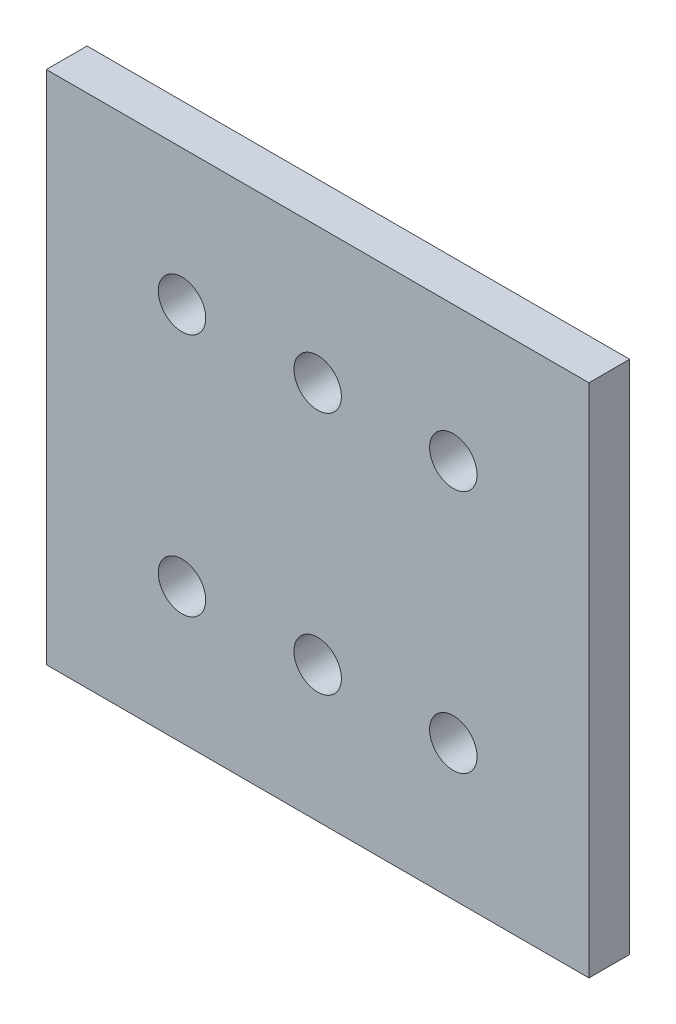
ISO-10303-21;
HEADER;
FILE_DESCRIPTION(('STEP AP214'),'2;1');
FILE_NAME('part.step','',(''),(''),'','','');
FILE_SCHEMA(('AUTOMOTIVE_DESIGN { 1 0 10303 214 1 1 1 1 }'));
ENDSEC;
DATA;
#1=APPLICATION_CONTEXT('core data for automotive mechanical design processes');
#2=APPLICATION_PROTOCOL_DEFINITION('international standard','automotive_design',2000,#1);
#3=PRODUCT_CONTEXT('',#1,'mechanical');
#4=PRODUCT('Part','Part','',(#3));
#5=PRODUCT_RELATED_PRODUCT_CATEGORY('part','',(#4));
#6=PRODUCT_DEFINITION_FORMATION('','',#4);
#7=PRODUCT_DEFINITION_CONTEXT('part definition',#1,'design');
#8=PRODUCT_DEFINITION('design','',#6,#7);
#9=PRODUCT_DEFINITION_SHAPE('','',#8);
#10=(LENGTH_UNIT() NAMED_UNIT(*) SI_UNIT(.MILLI.,.METRE.));
#11=(NAMED_UNIT(*) PLANE_ANGLE_UNIT() SI_UNIT($,.RADIAN.));
#12=(NAMED_UNIT(*) SI_UNIT($,.STERADIAN.) SOLID_ANGLE_UNIT());
#13=UNCERTAINTY_MEASURE_WITH_UNIT(LENGTH_MEASURE(1.E-05),#10,'distance_accuracy_value','');
#14=(GEOMETRIC_REPRESENTATION_CONTEXT(3) GLOBAL_UNCERTAINTY_ASSIGNED_CONTEXT((#13)) GLOBAL_UNIT_ASSIGNED_CONTEXT((#10,
#11,#12)) REPRESENTATION_CONTEXT('',''));
#15=CARTESIAN_POINT('',(0.,0.,0.));
#16=DIRECTION('',(0.,0.,1.));
#17=DIRECTION('',(1.,0.,0.));
#18=AXIS2_PLACEMENT_3D('',#15,#16,#17);
#19=CARTESIAN_POINT('',(0.,0.,3.));
#20=DIRECTION('',(0.,0.,-1.));
#21=DIRECTION('',(-1.,0.,0.));
#22=AXIS2_PLACEMENT_3D('',#19,#20,#21);
#23=PLANE('',#22);
#24=DIRECTION('',(0.,-1.,0.));
#25=VECTOR('',#24,1.);
#26=CARTESIAN_POINT('',(0.,0.,3.));
#27=LINE('',#26,#25);
#28=CARTESIAN_POINT('',(0.,38.,3.));
#29=VERTEX_POINT('',#28);
#30=CARTESIAN_POINT('',(0.,0.,3.));
#31=VERTEX_POINT('',#30);
#32=EDGE_CURVE('E98',#29,#31,#27,.T.);
#33=ORIENTED_EDGE('',*,*,#32,.T.);
#34=DIRECTION('',(1.,0.,0.));
#35=VECTOR('',#34,1.);
#36=CARTESIAN_POINT('',(0.,0.,3.));
#37=LINE('',#36,#35);
#38=CARTESIAN_POINT('',(40.,0.,3.));
#39=VERTEX_POINT('',#38);
#40=EDGE_CURVE('E93',#31,#39,#37,.T.);
#41=ORIENTED_EDGE('',*,*,#40,.T.);
#42=DIRECTION('',(0.,1.,0.));
#43=VECTOR('',#42,1.);
#44=CARTESIAN_POINT('',(40.,0.,3.));
#45=LINE('',#44,#43);
#46=CARTESIAN_POINT('',(40.,38.,3.));
#47=VERTEX_POINT('',#46);
#48=EDGE_CURVE('E96',#39,#47,#45,.T.);
#49=ORIENTED_EDGE('',*,*,#48,.T.);
#50=DIRECTION('',(-1.,0.,0.));
#51=VECTOR('',#50,1.);
#52=CARTESIAN_POINT('',(0.,38.,3.));
#53=LINE('',#52,#51);
#54=EDGE_CURVE('E63',#47,#29,#53,.T.);
#55=ORIENTED_EDGE('',*,*,#54,.T.);
#56=EDGE_LOOP('',(#33,#41,#49,#55));
#57=FACE_BOUND('',#56,.T.);
#58=CARTESIAN_POINT('',(10.,10.,3.));
#59=DIRECTION('',(0.,0.,1.));
#60=DIRECTION('',(1.,0.,0.));
#61=AXIS2_PLACEMENT_3D('',#58,#59,#60);
#62=CIRCLE('',#61,1.75);
#63=CARTESIAN_POINT('',(11.75,10.,3.));
#64=VERTEX_POINT('',#63);
#65=EDGE_CURVE('E118',#64,#64,#62,.T.);
#66=ORIENTED_EDGE('',*,*,#65,.F.);
#67=EDGE_LOOP('',(#66));
#68=FACE_BOUND('',#67,.T.);
#69=CARTESIAN_POINT('',(20.,10.,3.));
#70=DIRECTION('',(0.,0.,1.));
#71=DIRECTION('',(1.,0.,0.));
#72=AXIS2_PLACEMENT_3D('',#69,#70,#71);
#73=CIRCLE('',#72,1.75);
#74=CARTESIAN_POINT('',(21.75,10.,3.));
#75=VERTEX_POINT('',#74);
#76=EDGE_CURVE('E140',#75,#75,#73,.T.);
#77=ORIENTED_EDGE('',*,*,#76,.F.);
#78=EDGE_LOOP('',(#77));
#79=FACE_BOUND('',#78,.T.);
#80=CARTESIAN_POINT('',(30.,10.,3.));
#81=DIRECTION('',(0.,0.,1.));
#82=DIRECTION('',(1.,0.,0.));
#83=AXIS2_PLACEMENT_3D('',#80,#81,#82);
#84=CIRCLE('',#83,1.75);
#85=CARTESIAN_POINT('',(31.75,10.,3.));
#86=VERTEX_POINT('',#85);
#87=EDGE_CURVE('E148',#86,#86,#84,.T.);
#88=ORIENTED_EDGE('',*,*,#87,.F.);
#89=EDGE_LOOP('',(#88));
#90=FACE_BOUND('',#89,.T.);
#91=CARTESIAN_POINT('',(10.,28.,3.));
#92=DIRECTION('',(0.,0.,1.));
#93=DIRECTION('',(1.,0.,0.));
#94=AXIS2_PLACEMENT_3D('',#91,#92,#93);
#95=CIRCLE('',#94,1.75);
#96=CARTESIAN_POINT('',(11.75,28.,3.));
#97=VERTEX_POINT('',#96);
#98=EDGE_CURVE('E156',#97,#97,#95,.T.);
#99=ORIENTED_EDGE('',*,*,#98,.F.);
#100=EDGE_LOOP('',(#99));
#101=FACE_BOUND('',#100,.T.);
#102=CARTESIAN_POINT('',(20.,28.,3.));
#103=DIRECTION('',(0.,0.,1.));
#104=DIRECTION('',(1.,0.,0.));
#105=AXIS2_PLACEMENT_3D('',#102,#103,#104);
#106=CIRCLE('',#105,1.75);
#107=CARTESIAN_POINT('',(21.75,28.,3.));
#108=VERTEX_POINT('',#107);
#109=EDGE_CURVE('E164',#108,#108,#106,.T.);
#110=ORIENTED_EDGE('',*,*,#109,.F.);
#111=EDGE_LOOP('',(#110));
#112=FACE_BOUND('',#111,.T.);
#113=CARTESIAN_POINT('',(30.,28.,3.));
#114=DIRECTION('',(0.,0.,1.));
#115=DIRECTION('',(1.,0.,0.));
#116=AXIS2_PLACEMENT_3D('',#113,#114,#115);
#117=CIRCLE('',#116,1.75);
#118=CARTESIAN_POINT('',(31.75,28.,3.));
#119=VERTEX_POINT('',#118);
#120=EDGE_CURVE('E172',#119,#119,#117,.T.);
#121=ORIENTED_EDGE('',*,*,#120,.F.);
#122=EDGE_LOOP('',(#121));
#123=FACE_BOUND('',#122,.T.);
#124=ADVANCED_FACE('F45',(#57,#68,#79,#90,#101,#112,#123),#23,.F.);
#125=CARTESIAN_POINT('',(0.,0.,0.));
#126=DIRECTION('',(0.,0.,-1.));
#127=DIRECTION('',(-1.,0.,0.));
#128=AXIS2_PLACEMENT_3D('',#125,#126,#127);
#129=PLANE('',#128);
#130=CARTESIAN_POINT('',(20.,28.,0.));
#131=DIRECTION('',(0.,0.,1.));
#132=DIRECTION('',(1.,0.,0.));
#133=AXIS2_PLACEMENT_3D('',#130,#131,#132);
#134=CIRCLE('',#133,1.75);
#135=CARTESIAN_POINT('',(21.75,28.,0.));
#136=VERTEX_POINT('',#135);
#137=EDGE_CURVE('E168',#136,#136,#134,.T.);
#138=ORIENTED_EDGE('',*,*,#137,.T.);
#139=EDGE_LOOP('',(#138));
#140=FACE_BOUND('',#139,.T.);
#141=CARTESIAN_POINT('',(30.,10.,0.));
#142=DIRECTION('',(0.,0.,1.));
#143=DIRECTION('',(1.,0.,0.));
#144=AXIS2_PLACEMENT_3D('',#141,#142,#143);
#145=CIRCLE('',#144,1.75);
#146=CARTESIAN_POINT('',(31.75,10.,0.));
#147=VERTEX_POINT('',#146);
#148=EDGE_CURVE('E152',#147,#147,#145,.T.);
#149=ORIENTED_EDGE('',*,*,#148,.T.);
#150=EDGE_LOOP('',(#149));
#151=FACE_BOUND('',#150,.T.);
#152=CARTESIAN_POINT('',(10.,10.,0.));
#153=DIRECTION('',(0.,0.,1.));
#154=DIRECTION('',(1.,0.,0.));
#155=AXIS2_PLACEMENT_3D('',#152,#153,#154);
#156=CIRCLE('',#155,1.75);
#157=CARTESIAN_POINT('',(11.75,10.,0.));
#158=VERTEX_POINT('',#157);
#159=EDGE_CURVE('E136',#158,#158,#156,.T.);
#160=ORIENTED_EDGE('',*,*,#159,.T.);
#161=EDGE_LOOP('',(#160));
#162=FACE_BOUND('',#161,.T.);
#163=DIRECTION('',(0.,-1.,0.));
#164=VECTOR('',#163,1.);
#165=CARTESIAN_POINT('',(0.,0.,0.));
#166=LINE('',#165,#164);
#167=CARTESIAN_POINT('',(0.,38.,0.));
#168=VERTEX_POINT('',#167);
#169=CARTESIAN_POINT('',(0.,0.,0.));
#170=VERTEX_POINT('',#169);
#171=EDGE_CURVE('E114',#168,#170,#166,.T.);
#172=ORIENTED_EDGE('',*,*,#171,.F.);
#173=DIRECTION('',(-1.,0.,0.));
#174=VECTOR('',#173,1.);
#175=CARTESIAN_POINT('',(0.,38.,0.));
#176=LINE('',#175,#174);
#177=CARTESIAN_POINT('',(40.,38.,0.));
#178=VERTEX_POINT('',#177);
#179=EDGE_CURVE('E86',#178,#168,#176,.T.);
#180=ORIENTED_EDGE('',*,*,#179,.F.);
#181=DIRECTION('',(0.,1.,0.));
#182=VECTOR('',#181,1.);
#183=CARTESIAN_POINT('',(40.,0.,0.));
#184=LINE('',#183,#182);
#185=CARTESIAN_POINT('',(40.,0.,0.));
#186=VERTEX_POINT('',#185);
#187=EDGE_CURVE('E80',#186,#178,#184,.T.);
#188=ORIENTED_EDGE('',*,*,#187,.F.);
#189=DIRECTION('',(1.,0.,0.));
#190=VECTOR('',#189,1.);
#191=CARTESIAN_POINT('',(0.,0.,0.));
#192=LINE('',#191,#190);
#193=EDGE_CURVE('E103',#170,#186,#192,.T.);
#194=ORIENTED_EDGE('',*,*,#193,.F.);
#195=EDGE_LOOP('',(#172,#180,#188,#194));
#196=FACE_BOUND('',#195,.T.);
#197=CARTESIAN_POINT('',(20.,10.,0.));
#198=DIRECTION('',(0.,0.,1.));
#199=DIRECTION('',(1.,0.,0.));
#200=AXIS2_PLACEMENT_3D('',#197,#198,#199);
#201=CIRCLE('',#200,1.75);
#202=CARTESIAN_POINT('',(21.75,10.,0.));
#203=VERTEX_POINT('',#202);
#204=EDGE_CURVE('E144',#203,#203,#201,.T.);
#205=ORIENTED_EDGE('',*,*,#204,.T.);
#206=EDGE_LOOP('',(#205));
#207=FACE_BOUND('',#206,.T.);
#208=CARTESIAN_POINT('',(10.,28.,0.));
#209=DIRECTION('',(0.,0.,1.));
#210=DIRECTION('',(1.,0.,0.));
#211=AXIS2_PLACEMENT_3D('',#208,#209,#210);
#212=CIRCLE('',#211,1.75);
#213=CARTESIAN_POINT('',(11.75,28.,0.));
#214=VERTEX_POINT('',#213);
#215=EDGE_CURVE('E160',#214,#214,#212,.T.);
#216=ORIENTED_EDGE('',*,*,#215,.T.);
#217=EDGE_LOOP('',(#216));
#218=FACE_BOUND('',#217,.T.);
#219=CARTESIAN_POINT('',(30.,28.,0.));
#220=DIRECTION('',(0.,0.,1.));
#221=DIRECTION('',(1.,0.,0.));
#222=AXIS2_PLACEMENT_3D('',#219,#220,#221);
#223=CIRCLE('',#222,1.75);
#224=CARTESIAN_POINT('',(31.75,28.,0.));
#225=VERTEX_POINT('',#224);
#226=EDGE_CURVE('E176',#225,#225,#223,.T.);
#227=ORIENTED_EDGE('',*,*,#226,.T.);
#228=EDGE_LOOP('',(#227));
#229=FACE_BOUND('',#228,.T.);
#230=ADVANCED_FACE('F131',(#140,#151,#162,#196,#207,#218,#229),#129,.T.);
#231=CARTESIAN_POINT('',(0.,0.,3.));
#232=DIRECTION('',(1.,0.,0.));
#233=DIRECTION('',(0.,0.,-1.));
#234=AXIS2_PLACEMENT_3D('',#231,#232,#233);
#235=PLANE('',#234);
#236=ORIENTED_EDGE('',*,*,#171,.T.);
#237=DIRECTION('',(0.,0.,-1.));
#238=VECTOR('',#237,1.);
#239=CARTESIAN_POINT('',(0.,0.,3.));
#240=LINE('',#239,#238);
#241=EDGE_CURVE('E11',#31,#170,#240,.T.);
#242=ORIENTED_EDGE('',*,*,#241,.F.);
#243=ORIENTED_EDGE('',*,*,#32,.F.);
#244=DIRECTION('',(0.,0.,-1.));
#245=VECTOR('',#244,1.);
#246=CARTESIAN_POINT('',(0.,38.,3.));
#247=LINE('',#246,#245);
#248=EDGE_CURVE('E110',#29,#168,#247,.T.);
#249=ORIENTED_EDGE('',*,*,#248,.T.);
#250=EDGE_LOOP('',(#236,#242,#243,#249));
#251=FACE_BOUND('',#250,.T.);
#252=ADVANCED_FACE('F47',(#251),#235,.F.);
#253=CARTESIAN_POINT('',(0.,0.,3.));
#254=DIRECTION('',(0.,1.,0.));
#255=DIRECTION('',(0.,0.,1.));
#256=AXIS2_PLACEMENT_3D('',#253,#254,#255);
#257=PLANE('',#256);
#258=ORIENTED_EDGE('',*,*,#193,.T.);
#259=DIRECTION('',(0.,0.,-1.));
#260=VECTOR('',#259,1.);
#261=CARTESIAN_POINT('',(40.,0.,3.));
#262=LINE('',#261,#260);
#263=EDGE_CURVE('E55',#39,#186,#262,.T.);
#264=ORIENTED_EDGE('',*,*,#263,.F.);
#265=ORIENTED_EDGE('',*,*,#40,.F.);
#266=ORIENTED_EDGE('',*,*,#241,.T.);
#267=EDGE_LOOP('',(#258,#264,#265,#266));
#268=FACE_BOUND('',#267,.T.);
#269=ADVANCED_FACE('F102',(#268),#257,.F.);
#270=CARTESIAN_POINT('',(40.,0.,3.));
#271=DIRECTION('',(-1.,0.,0.));
#272=DIRECTION('',(0.,0.,1.));
#273=AXIS2_PLACEMENT_3D('',#270,#271,#272);
#274=PLANE('',#273);
#275=ORIENTED_EDGE('',*,*,#187,.T.);
#276=DIRECTION('',(0.,0.,-1.));
#277=VECTOR('',#276,1.);
#278=CARTESIAN_POINT('',(40.,38.,3.));
#279=LINE('',#278,#277);
#280=EDGE_CURVE('E105',#47,#178,#279,.T.);
#281=ORIENTED_EDGE('',*,*,#280,.F.);
#282=ORIENTED_EDGE('',*,*,#48,.F.);
#283=ORIENTED_EDGE('',*,*,#263,.T.);
#284=EDGE_LOOP('',(#275,#281,#282,#283));
#285=FACE_BOUND('',#284,.T.);
#286=ADVANCED_FACE('F106',(#285),#274,.F.);
#287=CARTESIAN_POINT('',(0.,38.,3.));
#288=DIRECTION('',(0.,-1.,0.));
#289=DIRECTION('',(0.,0.,-1.));
#290=AXIS2_PLACEMENT_3D('',#287,#288,#289);
#291=PLANE('',#290);
#292=ORIENTED_EDGE('',*,*,#179,.T.);
#293=ORIENTED_EDGE('',*,*,#248,.F.);
#294=ORIENTED_EDGE('',*,*,#54,.F.);
#295=ORIENTED_EDGE('',*,*,#280,.T.);
#296=EDGE_LOOP('',(#292,#293,#294,#295));
#297=FACE_BOUND('',#296,.T.);
#298=ADVANCED_FACE('F128',(#297),#291,.F.);
#299=CARTESIAN_POINT('',(10.,10.,3.));
#300=DIRECTION('',(0.,0.,-1.));
#301=DIRECTION('',(-1.,0.,0.));
#302=AXIS2_PLACEMENT_3D('',#299,#300,#301);
#303=CYLINDRICAL_SURFACE('',#302,1.75);
#304=ORIENTED_EDGE('',*,*,#65,.T.);
#305=EDGE_LOOP('',(#304));
#306=FACE_BOUND('',#305,.T.);
#307=ORIENTED_EDGE('',*,*,#159,.F.);
#308=EDGE_LOOP('',(#307));
#309=FACE_BOUND('',#308,.T.);
#310=ADVANCED_FACE('F195',(#306,#309),#303,.F.);
#311=CARTESIAN_POINT('',(20.,10.,3.));
#312=DIRECTION('',(0.,0.,-1.));
#313=DIRECTION('',(-1.,0.,0.));
#314=AXIS2_PLACEMENT_3D('',#311,#312,#313);
#315=CYLINDRICAL_SURFACE('',#314,1.75);
#316=ORIENTED_EDGE('',*,*,#76,.T.);
#317=EDGE_LOOP('',(#316));
#318=FACE_BOUND('',#317,.T.);
#319=ORIENTED_EDGE('',*,*,#204,.F.);
#320=EDGE_LOOP('',(#319));
#321=FACE_BOUND('',#320,.T.);
#322=ADVANCED_FACE('F240',(#318,#321),#315,.F.);
#323=CARTESIAN_POINT('',(30.,10.,3.));
#324=DIRECTION('',(0.,0.,-1.));
#325=DIRECTION('',(-1.,0.,0.));
#326=AXIS2_PLACEMENT_3D('',#323,#324,#325);
#327=CYLINDRICAL_SURFACE('',#326,1.75);
#328=ORIENTED_EDGE('',*,*,#87,.T.);
#329=EDGE_LOOP('',(#328));
#330=FACE_BOUND('',#329,.T.);
#331=ORIENTED_EDGE('',*,*,#148,.F.);
#332=EDGE_LOOP('',(#331));
#333=FACE_BOUND('',#332,.T.);
#334=ADVANCED_FACE('F248',(#330,#333),#327,.F.);
#335=CARTESIAN_POINT('',(10.,28.,3.));
#336=DIRECTION('',(0.,0.,-1.));
#337=DIRECTION('',(-1.,0.,0.));
#338=AXIS2_PLACEMENT_3D('',#335,#336,#337);
#339=CYLINDRICAL_SURFACE('',#338,1.75);
#340=ORIENTED_EDGE('',*,*,#98,.T.);
#341=EDGE_LOOP('',(#340));
#342=FACE_BOUND('',#341,.T.);
#343=ORIENTED_EDGE('',*,*,#215,.F.);
#344=EDGE_LOOP('',(#343));
#345=FACE_BOUND('',#344,.T.);
#346=ADVANCED_FACE('F256',(#342,#345),#339,.F.);
#347=CARTESIAN_POINT('',(20.,28.,3.));
#348=DIRECTION('',(0.,0.,-1.));
#349=DIRECTION('',(-1.,0.,0.));
#350=AXIS2_PLACEMENT_3D('',#347,#348,#349);
#351=CYLINDRICAL_SURFACE('',#350,1.75);
#352=ORIENTED_EDGE('',*,*,#109,.T.);
#353=EDGE_LOOP('',(#352));
#354=FACE_BOUND('',#353,.T.);
#355=ORIENTED_EDGE('',*,*,#137,.F.);
#356=EDGE_LOOP('',(#355));
#357=FACE_BOUND('',#356,.T.);
#358=ADVANCED_FACE('F265',(#354,#357),#351,.F.);
#359=CARTESIAN_POINT('',(30.,28.,3.));
#360=DIRECTION('',(0.,0.,-1.));
#361=DIRECTION('',(-1.,0.,0.));
#362=AXIS2_PLACEMENT_3D('',#359,#360,#361);
#363=CYLINDRICAL_SURFACE('',#362,1.75);
#364=ORIENTED_EDGE('',*,*,#120,.T.);
#365=EDGE_LOOP('',(#364));
#366=FACE_BOUND('',#365,.T.);
#367=ORIENTED_EDGE('',*,*,#226,.F.);
#368=EDGE_LOOP('',(#367));
#369=FACE_BOUND('',#368,.T.);
#370=ADVANCED_FACE('F184',(#366,#369),#363,.F.);
#371=CLOSED_SHELL('',(#124,#230,#252,#269,#286,#298,#310,#322,#334,#346,#358,#370));
#372=MANIFOLD_SOLID_BREP('B2',#371);
#373=ADVANCED_BREP_SHAPE_REPRESENTATION('',(#18,#372),#14);
#374=SHAPE_DEFINITION_REPRESENTATION(#9,#373);
ENDSEC;
END-ISO-10303-21;
